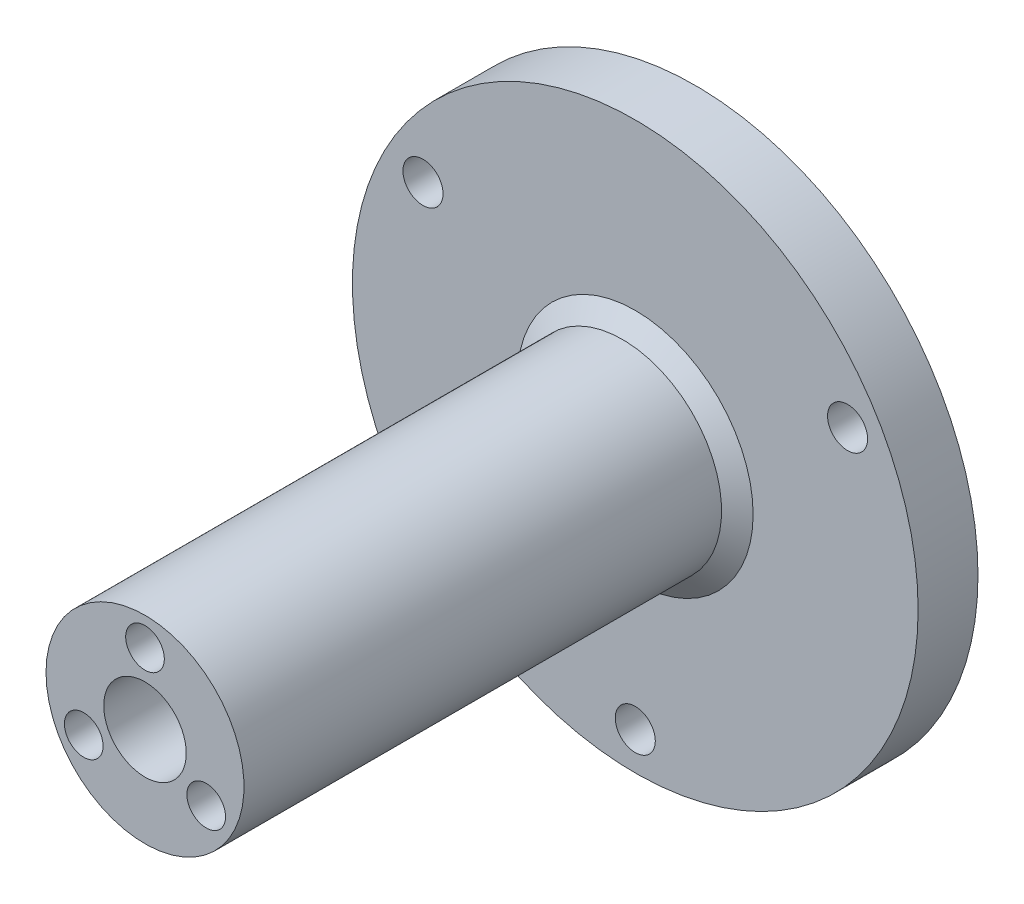
ISO-10303-21;
HEADER;
FILE_DESCRIPTION(('STEP AP214'),'2;1');
FILE_NAME('part.step','',(''),(''),'','','');
FILE_SCHEMA(('AUTOMOTIVE_DESIGN { 1 0 10303 214 1 1 1 1 }'));
ENDSEC;
DATA;
#1=APPLICATION_CONTEXT('core data for automotive mechanical design processes');
#2=APPLICATION_PROTOCOL_DEFINITION('international standard','automotive_design',2000,#1);
#3=PRODUCT_CONTEXT('',#1,'mechanical');
#4=PRODUCT('Part','Part','',(#3));
#5=PRODUCT_RELATED_PRODUCT_CATEGORY('part','',(#4));
#6=PRODUCT_DEFINITION_FORMATION('','',#4);
#7=PRODUCT_DEFINITION_CONTEXT('part definition',#1,'design');
#8=PRODUCT_DEFINITION('design','',#6,#7);
#9=PRODUCT_DEFINITION_SHAPE('','',#8);
#10=(LENGTH_UNIT() NAMED_UNIT(*) SI_UNIT(.MILLI.,.METRE.));
#11=(NAMED_UNIT(*) PLANE_ANGLE_UNIT() SI_UNIT($,.RADIAN.));
#12=(NAMED_UNIT(*) SI_UNIT($,.STERADIAN.) SOLID_ANGLE_UNIT());
#13=UNCERTAINTY_MEASURE_WITH_UNIT(LENGTH_MEASURE(1.E-05),#10,'distance_accuracy_value','');
#14=(GEOMETRIC_REPRESENTATION_CONTEXT(3) GLOBAL_UNCERTAINTY_ASSIGNED_CONTEXT((#13)) GLOBAL_UNIT_ASSIGNED_CONTEXT((#10,
#11,#12)) REPRESENTATION_CONTEXT('',''));
#15=CARTESIAN_POINT('',(0.,0.,0.));
#16=DIRECTION('',(0.,0.,1.));
#17=DIRECTION('',(1.,0.,0.));
#18=AXIS2_PLACEMENT_3D('',#15,#16,#17);
#19=CARTESIAN_POINT('',(0.,0.,6.35));
#20=DIRECTION('',(0.,0.,1.));
#21=DIRECTION('',(1.,0.,0.));
#22=AXIS2_PLACEMENT_3D('',#19,#20,#21);
#23=PLANE('',#22);
#24=CARTESIAN_POINT('',(0.,0.,6.35));
#25=DIRECTION('',(0.,0.,1.));
#26=DIRECTION('',(1.,0.,0.));
#27=AXIS2_PLACEMENT_3D('',#24,#25,#26);
#28=CIRCLE('',#27,12.5);
#29=CARTESIAN_POINT('',(12.5,0.,6.35));
#30=VERTEX_POINT('',#29);
#31=EDGE_CURVE('E10',#30,#30,#28,.F.);
#32=ORIENTED_EDGE('',*,*,#31,.T.);
#33=EDGE_LOOP('',(#32));
#34=FACE_BOUND('',#33,.T.);
#35=CARTESIAN_POINT('',(0.,0.,6.35));
#36=DIRECTION('',(0.,0.,1.));
#37=DIRECTION('',(1.,0.,0.));
#38=AXIS2_PLACEMENT_3D('',#35,#36,#37);
#39=CIRCLE('',#38,30.);
#40=CARTESIAN_POINT('',(30.,0.,6.35));
#41=VERTEX_POINT('',#40);
#42=EDGE_CURVE('E59',#41,#41,#39,.T.);
#43=ORIENTED_EDGE('',*,*,#42,.T.);
#44=EDGE_LOOP('',(#43));
#45=FACE_BOUND('',#44,.T.);
#46=CARTESIAN_POINT('',(0.,-26.,6.35));
#47=DIRECTION('',(0.,0.,1.));
#48=DIRECTION('',(1.,0.,0.));
#49=AXIS2_PLACEMENT_3D('',#46,#47,#48);
#50=CIRCLE('',#49,2.125);
#51=CARTESIAN_POINT('',(2.125,-26.,6.35));
#52=VERTEX_POINT('',#51);
#53=EDGE_CURVE('E79',#52,#52,#50,.T.);
#54=ORIENTED_EDGE('',*,*,#53,.F.);
#55=EDGE_LOOP('',(#54));
#56=FACE_BOUND('',#55,.T.);
#57=CARTESIAN_POINT('',(22.5166604983954,13.,6.35));
#58=DIRECTION('',(0.,0.,1.));
#59=DIRECTION('',(1.,0.,0.));
#60=AXIS2_PLACEMENT_3D('',#57,#58,#59);
#61=CIRCLE('',#60,2.125);
#62=CARTESIAN_POINT('',(24.6416604983954,13.,6.35));
#63=VERTEX_POINT('',#62);
#64=EDGE_CURVE('E82',#63,#63,#61,.T.);
#65=ORIENTED_EDGE('',*,*,#64,.F.);
#66=EDGE_LOOP('',(#65));
#67=FACE_BOUND('',#66,.T.);
#68=CARTESIAN_POINT('',(-22.5166604983954,13.,6.35));
#69=DIRECTION('',(0.,0.,1.));
#70=DIRECTION('',(1.,0.,0.));
#71=AXIS2_PLACEMENT_3D('',#68,#69,#70);
#72=CIRCLE('',#71,2.125);
#73=CARTESIAN_POINT('',(-20.3916604983954,13.,6.35));
#74=VERTEX_POINT('',#73);
#75=EDGE_CURVE('E63',#74,#74,#72,.T.);
#76=ORIENTED_EDGE('',*,*,#75,.F.);
#77=EDGE_LOOP('',(#76));
#78=FACE_BOUND('',#77,.T.);
#79=ADVANCED_FACE('F38',(#34,#45,#56,#67,#78),#23,.T.);
#80=CARTESIAN_POINT('',(0.,0.,6.35));
#81=DIRECTION('',(0.,0.,-1.));
#82=DIRECTION('',(-1.,0.,0.));
#83=AXIS2_PLACEMENT_3D('',#80,#81,#82);
#84=CYLINDRICAL_SURFACE('',#83,30.);
#85=ORIENTED_EDGE('',*,*,#42,.F.);
#86=EDGE_LOOP('',(#85));
#87=FACE_BOUND('',#86,.T.);
#88=CARTESIAN_POINT('',(0.,0.,0.));
#89=DIRECTION('',(0.,0.,1.));
#90=DIRECTION('',(1.,0.,0.));
#91=AXIS2_PLACEMENT_3D('',#88,#89,#90);
#92=CIRCLE('',#91,30.);
#93=CARTESIAN_POINT('',(30.,0.,0.));
#94=VERTEX_POINT('',#93);
#95=EDGE_CURVE('E64',#94,#94,#92,.T.);
#96=ORIENTED_EDGE('',*,*,#95,.T.);
#97=EDGE_LOOP('',(#96));
#98=FACE_BOUND('',#97,.T.);
#99=ADVANCED_FACE('F145',(#87,#98),#84,.T.);
#100=CARTESIAN_POINT('',(0.,-26.,6.35));
#101=DIRECTION('',(0.,0.,-1.));
#102=DIRECTION('',(-1.,0.,0.));
#103=AXIS2_PLACEMENT_3D('',#100,#101,#102);
#104=CYLINDRICAL_SURFACE('',#103,2.125);
#105=ORIENTED_EDGE('',*,*,#53,.T.);
#106=EDGE_LOOP('',(#105));
#107=FACE_BOUND('',#106,.T.);
#108=CARTESIAN_POINT('',(0.,-26.,0.));
#109=DIRECTION('',(0.,0.,1.));
#110=DIRECTION('',(1.,0.,0.));
#111=AXIS2_PLACEMENT_3D('',#108,#109,#110);
#112=CIRCLE('',#111,2.125);
#113=CARTESIAN_POINT('',(2.125,-26.,0.));
#114=VERTEX_POINT('',#113);
#115=EDGE_CURVE('E67',#114,#114,#112,.T.);
#116=ORIENTED_EDGE('',*,*,#115,.F.);
#117=EDGE_LOOP('',(#116));
#118=FACE_BOUND('',#117,.T.);
#119=ADVANCED_FACE('F150',(#107,#118),#104,.F.);
#120=CARTESIAN_POINT('',(22.5166604983954,13.,6.35));
#121=DIRECTION('',(0.,0.,-1.));
#122=DIRECTION('',(-1.,0.,0.));
#123=AXIS2_PLACEMENT_3D('',#120,#121,#122);
#124=CYLINDRICAL_SURFACE('',#123,2.125);
#125=ORIENTED_EDGE('',*,*,#64,.T.);
#126=EDGE_LOOP('',(#125));
#127=FACE_BOUND('',#126,.T.);
#128=CARTESIAN_POINT('',(22.5166604983954,13.,0.));
#129=DIRECTION('',(0.,0.,1.));
#130=DIRECTION('',(1.,0.,0.));
#131=AXIS2_PLACEMENT_3D('',#128,#129,#130);
#132=CIRCLE('',#131,2.125);
#133=CARTESIAN_POINT('',(24.6416604983954,13.,0.));
#134=VERTEX_POINT('',#133);
#135=EDGE_CURVE('E70',#134,#134,#132,.T.);
#136=ORIENTED_EDGE('',*,*,#135,.F.);
#137=EDGE_LOOP('',(#136));
#138=FACE_BOUND('',#137,.T.);
#139=ADVANCED_FACE('F167',(#127,#138),#124,.F.);
#140=CARTESIAN_POINT('',(-22.5166604983954,13.,6.35));
#141=DIRECTION('',(0.,0.,-1.));
#142=DIRECTION('',(-1.,0.,0.));
#143=AXIS2_PLACEMENT_3D('',#140,#141,#142);
#144=CYLINDRICAL_SURFACE('',#143,2.125);
#145=ORIENTED_EDGE('',*,*,#75,.T.);
#146=EDGE_LOOP('',(#145));
#147=FACE_BOUND('',#146,.T.);
#148=CARTESIAN_POINT('',(-22.5166604983954,13.,0.));
#149=DIRECTION('',(0.,0.,1.));
#150=DIRECTION('',(1.,0.,0.));
#151=AXIS2_PLACEMENT_3D('',#148,#149,#150);
#152=CIRCLE('',#151,2.125);
#153=CARTESIAN_POINT('',(-20.3916604983954,13.,0.));
#154=VERTEX_POINT('',#153);
#155=EDGE_CURVE('E73',#154,#154,#152,.T.);
#156=ORIENTED_EDGE('',*,*,#155,.F.);
#157=EDGE_LOOP('',(#156));
#158=FACE_BOUND('',#157,.T.);
#159=ADVANCED_FACE('F162',(#147,#158),#144,.F.);
#160=CARTESIAN_POINT('',(0.,0.,6.35));
#161=DIRECTION('',(0.,0.,-1.));
#162=DIRECTION('',(-1.,0.,0.));
#163=AXIS2_PLACEMENT_3D('',#160,#161,#162);
#164=CYLINDRICAL_SURFACE('',#163,7.675);
#165=CARTESIAN_POINT('',(0.,0.,45.6374079730314));
#166=DIRECTION('',(0.,0.,1.));
#167=DIRECTION('',(1.,0.,0.));
#168=AXIS2_PLACEMENT_3D('',#165,#166,#167);
#169=CIRCLE('',#168,7.675);
#170=CARTESIAN_POINT('',(-7.675,0.,45.6374079730314));
#171=VERTEX_POINT('',#170);
#172=EDGE_CURVE('E54',#171,#171,#169,.T.);
#173=ORIENTED_EDGE('',*,*,#172,.T.);
#174=EDGE_LOOP('',(#173));
#175=FACE_BOUND('',#174,.T.);
#176=CARTESIAN_POINT('',(0.,0.,0.));
#177=DIRECTION('',(0.,0.,1.));
#178=DIRECTION('',(1.,0.,0.));
#179=AXIS2_PLACEMENT_3D('',#176,#177,#178);
#180=CIRCLE('',#179,7.675);
#181=CARTESIAN_POINT('',(7.675,0.,0.));
#182=VERTEX_POINT('',#181);
#183=EDGE_CURVE('E60',#182,#182,#180,.T.);
#184=ORIENTED_EDGE('',*,*,#183,.F.);
#185=EDGE_LOOP('',(#184));
#186=FACE_BOUND('',#185,.T.);
#187=ADVANCED_FACE('F159',(#175,#186),#164,.F.);
#188=CARTESIAN_POINT('',(0.,0.,0.));
#189=DIRECTION('',(0.,0.,1.));
#190=DIRECTION('',(1.,0.,0.));
#191=AXIS2_PLACEMENT_3D('',#188,#189,#190);
#192=PLANE('',#191);
#193=ORIENTED_EDGE('',*,*,#155,.T.);
#194=EDGE_LOOP('',(#193));
#195=FACE_BOUND('',#194,.T.);
#196=ORIENTED_EDGE('',*,*,#135,.T.);
#197=EDGE_LOOP('',(#196));
#198=FACE_BOUND('',#197,.T.);
#199=ORIENTED_EDGE('',*,*,#115,.T.);
#200=EDGE_LOOP('',(#199));
#201=FACE_BOUND('',#200,.T.);
#202=ORIENTED_EDGE('',*,*,#95,.F.);
#203=EDGE_LOOP('',(#202));
#204=FACE_BOUND('',#203,.T.);
#205=ORIENTED_EDGE('',*,*,#183,.T.);
#206=EDGE_LOOP('',(#205));
#207=FACE_BOUND('',#206,.T.);
#208=ADVANCED_FACE('F156',(#195,#198,#201,#204,#207),#192,.F.);
#209=CARTESIAN_POINT('',(0.,0.,51.35));
#210=DIRECTION('',(0.,0.,-1.));
#211=DIRECTION('',(-1.,0.,0.));
#212=AXIS2_PLACEMENT_3D('',#209,#210,#211);
#213=CYLINDRICAL_SURFACE('',#212,10.5);
#214=CARTESIAN_POINT('',(0.,0.,7.69901703368487));
#215=DIRECTION('',(0.,0.,1.));
#216=DIRECTION('',(1.,0.,0.));
#217=AXIS2_PLACEMENT_3D('',#214,#215,#216);
#218=CIRCLE('',#217,10.5);
#219=CARTESIAN_POINT('',(-10.5,0.,7.69901703368486));
#220=VERTEX_POINT('',#219);
#221=EDGE_CURVE('E46',#220,#220,#218,.T.);
#222=CARTESIAN_POINT('',(0.,0.,58.35));
#223=DIRECTION('',(0.,0.,1.));
#224=DIRECTION('',(1.,0.,0.));
#225=AXIS2_PLACEMENT_3D('',#222,#223,#224);
#226=CIRCLE('',#225,10.5);
#227=CARTESIAN_POINT('',(-10.5,0.,58.35));
#228=VERTEX_POINT('',#227);
#229=EDGE_CURVE('E76',#228,#228,#226,.T.);
#230=CARTESIAN_POINT('',(-10.5,0.,7.69901703368486));
#231=CARTESIAN_POINT('',(-10.5,0.,8.22663143958398));
#232=CARTESIAN_POINT('',(-10.5,0.,8.75424584548309));
#233=CARTESIAN_POINT('',(-10.5,0.,9.80947465728132));
#234=CARTESIAN_POINT('',(-10.5,0.,10.3370890631804));
#235=CARTESIAN_POINT('',(-10.5,0.,11.3923178749787));
#236=CARTESIAN_POINT('',(-10.5,0.,11.9199322808778));
#237=CARTESIAN_POINT('',(-10.5,0.,12.975161092676));
#238=CARTESIAN_POINT('',(-10.5,0.,13.5027754985751));
#239=CARTESIAN_POINT('',(-10.5,0.,14.5580043103734));
#240=CARTESIAN_POINT('',(-10.5,0.,15.0856187162725));
#241=CARTESIAN_POINT('',(-10.5,0.,16.1408475280707));
#242=CARTESIAN_POINT('',(-10.5,0.,16.6684619339698));
#243=CARTESIAN_POINT('',(-10.5,0.,17.7236907457681));
#244=CARTESIAN_POINT('',(-10.5,0.,18.2513051516672));
#245=CARTESIAN_POINT('',(-10.5,0.,19.3065339634654));
#246=CARTESIAN_POINT('',(-10.5,0.,19.8341483693645));
#247=CARTESIAN_POINT('',(-10.5,0.,20.8893771811628));
#248=CARTESIAN_POINT('',(-10.5,0.,21.4169915870619));
#249=CARTESIAN_POINT('',(-10.5,0.,22.4722203988601));
#250=CARTESIAN_POINT('',(-10.5,0.,22.9998348047592));
#251=CARTESIAN_POINT('',(-10.5,0.,24.0550636165575));
#252=CARTESIAN_POINT('',(-10.5,0.,24.5826780224566));
#253=CARTESIAN_POINT('',(-10.5,0.,25.6379068342548));
#254=CARTESIAN_POINT('',(-10.5,0.,26.1655212401539));
#255=CARTESIAN_POINT('',(-10.5,0.,27.2207500519521));
#256=CARTESIAN_POINT('',(-10.5,0.,27.7483644578513));
#257=CARTESIAN_POINT('',(-10.5,0.,28.8035932696495));
#258=CARTESIAN_POINT('',(-10.5,0.,29.3312076755486));
#259=CARTESIAN_POINT('',(-10.5,0.,30.3864364873468));
#260=CARTESIAN_POINT('',(-10.5,0.,30.914050893246));
#261=CARTESIAN_POINT('',(-10.5,0.,31.9692797050442));
#262=CARTESIAN_POINT('',(-10.5,0.,32.4968941109433));
#263=CARTESIAN_POINT('',(-10.5,0.,33.5521229227415));
#264=CARTESIAN_POINT('',(-10.5,0.,34.0797373286407));
#265=CARTESIAN_POINT('',(-10.5,0.,35.1349661404389));
#266=CARTESIAN_POINT('',(-10.5,0.,35.662580546338));
#267=CARTESIAN_POINT('',(-10.5,0.,36.7178093581362));
#268=CARTESIAN_POINT('',(-10.5,0.,37.2454237640354));
#269=CARTESIAN_POINT('',(-10.5,0.,38.3006525758336));
#270=CARTESIAN_POINT('',(-10.5,0.,38.8282669817327));
#271=CARTESIAN_POINT('',(-10.5,0.,39.8834957935309));
#272=CARTESIAN_POINT('',(-10.5,0.,40.41111019943));
#273=CARTESIAN_POINT('',(-10.5,0.,41.4663390112283));
#274=CARTESIAN_POINT('',(-10.5,0.,41.9939534171274));
#275=CARTESIAN_POINT('',(-10.5,0.,43.0491822289256));
#276=CARTESIAN_POINT('',(-10.5,0.,43.5767966348247));
#277=CARTESIAN_POINT('',(-10.5,0.,44.632025446623));
#278=CARTESIAN_POINT('',(-10.5,0.,45.1596398525221));
#279=CARTESIAN_POINT('',(-10.5,0.,46.2148686643203));
#280=CARTESIAN_POINT('',(-10.5,0.,46.7424830702194));
#281=CARTESIAN_POINT('',(-10.5,0.,47.7977118820177));
#282=CARTESIAN_POINT('',(-10.5,0.,48.3253262879168));
#283=CARTESIAN_POINT('',(-10.5,0.,49.380555099715));
#284=CARTESIAN_POINT('',(-10.5,0.,49.9081695056141));
#285=CARTESIAN_POINT('',(-10.5,0.,50.9633983174124));
#286=CARTESIAN_POINT('',(-10.5,0.,51.4910127233115));
#287=CARTESIAN_POINT('',(-10.5,0.,52.5462415351097));
#288=CARTESIAN_POINT('',(-10.5,0.,53.0738559410088));
#289=CARTESIAN_POINT('',(-10.5,0.,54.1290847528071));
#290=CARTESIAN_POINT('',(-10.5,0.,54.6566991587062));
#291=CARTESIAN_POINT('',(-10.5,0.,55.7119279705044));
#292=CARTESIAN_POINT('',(-10.5,0.,56.2395423764035));
#293=CARTESIAN_POINT('',(-10.5,0.,57.2947711882018));
#294=CARTESIAN_POINT('',(-10.5,0.,57.8223855941009));
#295=CARTESIAN_POINT('',(-10.5,0.,58.35));
#296=B_SPLINE_CURVE_WITH_KNOTS('',3,(#230,#231,#232,#233,#234,#235,#236,#237,#238,#239,#240,
#241,#242,#243,#244,#245,#246,#247,#248,#249,#250,#251,#252,#253,#254,#255,#256,#257,#258,#259,
#260,#261,#262,#263,#264,#265,#266,#267,#268,#269,#270,#271,#272,#273,#274,#275,#276,#277,#278,
#279,#280,#281,#282,#283,#284,#285,#286,#287,#288,#289,#290,#291,#292,#293,#294,#295),
.UNSPECIFIED.,.F.,.F.,(4,2,2,2,2,2,2,2,2,2,2,2,2,2,2,2,2,2,2,2,2,2,2,2,2,2,2,2,2,2,2,2,4),(0.,
1.58284321769735,3.16568643539469,4.74852965309204,6.33137287078939,7.91421608848674,
9.49705930618409,11.0799025238814,12.6627457415788,14.2455889592761,15.8284321769735,
17.4112753946708,18.9941186123682,20.5769618300655,22.1598050477629,23.7426482654602,
25.3254914831576,26.9083347008549,28.4911779185523,30.0740211362496,31.656864353947,
33.2397075716443,34.8225507893416,36.405394007039,37.9882372247363,39.5710804424337,
41.153923660131,42.7367668778284,44.3196100955257,45.9024533132231,47.4852965309204,
49.0681397486178,50.6509829663151),.UNSPECIFIED.);
#297=EDGE_CURVE('BSEAM124',#220,#228,#296,.T.);
#298=ORIENTED_EDGE('',*,*,#221,.T.);
#299=ORIENTED_EDGE('',*,*,#229,.F.);
#300=ORIENTED_EDGE('',*,*,#297,.T.);
#301=ORIENTED_EDGE('',*,*,#297,.F.);
#302=EDGE_LOOP('',(#298,#300,#299,#301));
#303=FACE_BOUND('',#302,.T.);
#304=ADVANCED_FACE('F124',(#303),#213,.T.);
#305=CARTESIAN_POINT('',(0.,0.,58.35));
#306=DIRECTION('',(0.,0.,1.));
#307=DIRECTION('',(1.,0.,0.));
#308=AXIS2_PLACEMENT_3D('',#305,#306,#307);
#309=PLANE('',#308);
#310=CARTESIAN_POINT('',(0.,7.5,58.35));
#311=DIRECTION('',(0.,0.,1.));
#312=DIRECTION('',(1.,0.,0.));
#313=AXIS2_PLACEMENT_3D('',#310,#311,#312);
#314=CIRCLE('',#313,2.05);
#315=CARTESIAN_POINT('',(2.05,7.5,58.35));
#316=VERTEX_POINT('',#315);
#317=EDGE_CURVE('E105',#316,#316,#314,.T.);
#318=ORIENTED_EDGE('',*,*,#317,.F.);
#319=EDGE_LOOP('',(#318));
#320=FACE_BOUND('',#319,.T.);
#321=CARTESIAN_POINT('',(-6.49519052838329,-3.75,58.35));
#322=DIRECTION('',(0.,0.,1.));
#323=DIRECTION('',(1.,0.,0.));
#324=AXIS2_PLACEMENT_3D('',#321,#322,#323);
#325=CIRCLE('',#324,2.05);
#326=CARTESIAN_POINT('',(-4.44519052838329,-3.75,58.35));
#327=VERTEX_POINT('',#326);
#328=EDGE_CURVE('E99',#327,#327,#325,.T.);
#329=ORIENTED_EDGE('',*,*,#328,.F.);
#330=EDGE_LOOP('',(#329));
#331=FACE_BOUND('',#330,.T.);
#332=CARTESIAN_POINT('',(6.49519052838329,-3.75,58.35));
#333=DIRECTION('',(0.,0.,1.));
#334=DIRECTION('',(1.,0.,0.));
#335=AXIS2_PLACEMENT_3D('',#332,#333,#334);
#336=CIRCLE('',#335,2.05);
#337=CARTESIAN_POINT('',(8.54519052838329,-3.75,58.35));
#338=VERTEX_POINT('',#337);
#339=EDGE_CURVE('E93',#338,#338,#336,.T.);
#340=ORIENTED_EDGE('',*,*,#339,.F.);
#341=EDGE_LOOP('',(#340));
#342=FACE_BOUND('',#341,.T.);
#343=ORIENTED_EDGE('',*,*,#229,.T.);
#344=EDGE_LOOP('',(#343));
#345=FACE_BOUND('',#344,.T.);
#346=CARTESIAN_POINT('',(0.,0.,58.35));
#347=DIRECTION('',(0.,0.,1.));
#348=DIRECTION('',(1.,0.,0.));
#349=AXIS2_PLACEMENT_3D('',#346,#347,#348);
#350=CIRCLE('',#349,4.375);
#351=CARTESIAN_POINT('',(4.375,0.,58.35));
#352=VERTEX_POINT('',#351);
#353=EDGE_CURVE('E89',#352,#352,#350,.T.);
#354=ORIENTED_EDGE('',*,*,#353,.F.);
#355=EDGE_LOOP('',(#354));
#356=FACE_BOUND('',#355,.T.);
#357=ADVANCED_FACE('F120',(#320,#331,#342,#345,#356),#309,.T.);
#358=CARTESIAN_POINT('',(0.,0.,58.35));
#359=DIRECTION('',(0.,0.,-1.));
#360=DIRECTION('',(-1.,0.,0.));
#361=AXIS2_PLACEMENT_3D('',#358,#359,#360);
#362=CYLINDRICAL_SURFACE('',#361,4.375);
#363=CARTESIAN_POINT('',(0.,0.,50.3502963952805));
#364=DIRECTION('',(0.,0.,-1.));
#365=DIRECTION('',(-1.,0.,0.));
#366=AXIS2_PLACEMENT_3D('',#363,#364,#365);
#367=CIRCLE('',#366,4.375);
#368=CARTESIAN_POINT('',(-4.375,0.,50.3502963952805));
#369=VERTEX_POINT('',#368);
#370=EDGE_CURVE('E50',#369,#369,#367,.T.);
#371=ORIENTED_EDGE('',*,*,#370,.T.);
#372=EDGE_LOOP('',(#371));
#373=FACE_BOUND('',#372,.T.);
#374=ORIENTED_EDGE('',*,*,#353,.T.);
#375=EDGE_LOOP('',(#374));
#376=FACE_BOUND('',#375,.T.);
#377=ADVANCED_FACE('F123',(#373,#376),#362,.F.);
#378=CARTESIAN_POINT('',(6.49519052838329,-3.75,52.35));
#379=DIRECTION('',(0.,0.,1.));
#380=DIRECTION('',(1.,0.,0.));
#381=AXIS2_PLACEMENT_3D('',#378,#379,#380);
#382=CYLINDRICAL_SURFACE('',#381,2.05);
#383=CARTESIAN_POINT('',(6.49519052838329,-3.75,52.35));
#384=DIRECTION('',(0.,0.,1.));
#385=DIRECTION('',(1.,0.,0.));
#386=AXIS2_PLACEMENT_3D('',#383,#384,#385);
#387=CIRCLE('',#386,2.05);
#388=CARTESIAN_POINT('',(8.54519052838329,-3.75,52.35));
#389=VERTEX_POINT('',#388);
#390=EDGE_CURVE('E96',#389,#389,#387,.T.);
#391=ORIENTED_EDGE('',*,*,#390,.F.);
#392=EDGE_LOOP('',(#391));
#393=FACE_BOUND('',#392,.T.);
#394=ORIENTED_EDGE('',*,*,#339,.T.);
#395=EDGE_LOOP('',(#394));
#396=FACE_BOUND('',#395,.T.);
#397=ADVANCED_FACE('F135',(#393,#396),#382,.F.);
#398=CARTESIAN_POINT('',(0.,0.,52.35));
#399=DIRECTION('',(0.,0.,1.));
#400=DIRECTION('',(1.,0.,0.));
#401=AXIS2_PLACEMENT_3D('',#398,#399,#400);
#402=PLANE('',#401);
#403=ORIENTED_EDGE('',*,*,#390,.T.);
#404=EDGE_LOOP('',(#403));
#405=FACE_BOUND('',#404,.T.);
#406=ADVANCED_FACE('F141',(#405),#402,.T.);
#407=CARTESIAN_POINT('',(-6.49519052838329,-3.75,52.35));
#408=DIRECTION('',(0.,0.,1.));
#409=DIRECTION('',(1.,0.,0.));
#410=AXIS2_PLACEMENT_3D('',#407,#408,#409);
#411=CYLINDRICAL_SURFACE('',#410,2.05);
#412=CARTESIAN_POINT('',(-6.49519052838329,-3.75,52.35));
#413=DIRECTION('',(0.,0.,1.));
#414=DIRECTION('',(1.,0.,0.));
#415=AXIS2_PLACEMENT_3D('',#412,#413,#414);
#416=CIRCLE('',#415,2.05);
#417=CARTESIAN_POINT('',(-4.44519052838329,-3.75,52.35));
#418=VERTEX_POINT('',#417);
#419=EDGE_CURVE('E102',#418,#418,#416,.T.);
#420=ORIENTED_EDGE('',*,*,#419,.F.);
#421=EDGE_LOOP('',(#420));
#422=FACE_BOUND('',#421,.T.);
#423=ORIENTED_EDGE('',*,*,#328,.T.);
#424=EDGE_LOOP('',(#423));
#425=FACE_BOUND('',#424,.T.);
#426=ADVANCED_FACE('F197',(#422,#425),#411,.F.);
#427=CARTESIAN_POINT('',(0.,0.,52.35));
#428=DIRECTION('',(0.,0.,1.));
#429=DIRECTION('',(1.,0.,0.));
#430=AXIS2_PLACEMENT_3D('',#427,#428,#429);
#431=PLANE('',#430);
#432=ORIENTED_EDGE('',*,*,#419,.T.);
#433=EDGE_LOOP('',(#432));
#434=FACE_BOUND('',#433,.T.);
#435=ADVANCED_FACE('F116',(#434),#431,.T.);
#436=CARTESIAN_POINT('',(0.,7.5,52.35));
#437=DIRECTION('',(0.,0.,1.));
#438=DIRECTION('',(1.,0.,0.));
#439=AXIS2_PLACEMENT_3D('',#436,#437,#438);
#440=CYLINDRICAL_SURFACE('',#439,2.05);
#441=CARTESIAN_POINT('',(0.,7.5,52.35));
#442=DIRECTION('',(0.,0.,1.));
#443=DIRECTION('',(1.,0.,0.));
#444=AXIS2_PLACEMENT_3D('',#441,#442,#443);
#445=CIRCLE('',#444,2.05);
#446=CARTESIAN_POINT('',(2.05,7.5,52.35));
#447=VERTEX_POINT('',#446);
#448=EDGE_CURVE('E92',#447,#447,#445,.T.);
#449=ORIENTED_EDGE('',*,*,#448,.F.);
#450=EDGE_LOOP('',(#449));
#451=FACE_BOUND('',#450,.T.);
#452=ORIENTED_EDGE('',*,*,#317,.T.);
#453=EDGE_LOOP('',(#452));
#454=FACE_BOUND('',#453,.T.);
#455=ADVANCED_FACE('F113',(#451,#454),#440,.F.);
#456=CARTESIAN_POINT('',(0.,0.,52.35));
#457=DIRECTION('',(0.,0.,1.));
#458=DIRECTION('',(1.,0.,0.));
#459=AXIS2_PLACEMENT_3D('',#456,#457,#458);
#460=PLANE('',#459);
#461=ORIENTED_EDGE('',*,*,#448,.T.);
#462=EDGE_LOOP('',(#461));
#463=FACE_BOUND('',#462,.T.);
#464=ADVANCED_FACE('F111',(#463),#460,.T.);
#465=CARTESIAN_POINT('',(0.,0.,45.6374079730314));
#466=DIRECTION('',(0.,0.,-1.));
#467=DIRECTION('',(-1.,0.,0.));
#468=AXIS2_PLACEMENT_3D('',#465,#466,#467);
#469=CONICAL_SURFACE('',#468,7.675,0.610865238198011);
#470=CARTESIAN_POINT('',(-4.375,0.,50.3502963952805));
#471=CARTESIAN_POINT('',(-4.409375,0.,50.3012038075487));
#472=CARTESIAN_POINT('',(-4.44375,0.,50.2521112198169));
#473=CARTESIAN_POINT('',(-4.5125,0.,50.1539260443534));
#474=CARTESIAN_POINT('',(-4.546875,0.,50.1048334566216));
#475=CARTESIAN_POINT('',(-4.615625,0.,50.0066482811581));
#476=CARTESIAN_POINT('',(-4.65,0.,49.9575556934264));
#477=CARTESIAN_POINT('',(-4.71875,0.,49.8593705179628));
#478=CARTESIAN_POINT('',(-4.753125,0.,49.8102779302311));
#479=CARTESIAN_POINT('',(-4.821875,0.,49.7120927547676));
#480=CARTESIAN_POINT('',(-4.85625,0.,49.6630001670358));
#481=CARTESIAN_POINT('',(-4.925,0.,49.5648149915723));
#482=CARTESIAN_POINT('',(-4.959375,0.,49.5157224038405));
#483=CARTESIAN_POINT('',(-5.028125,0.,49.417537228377));
#484=CARTESIAN_POINT('',(-5.0625,0.,49.3684446406452));
#485=CARTESIAN_POINT('',(-5.13125,0.,49.2702594651817));
#486=CARTESIAN_POINT('',(-5.165625,0.,49.22116687745));
#487=CARTESIAN_POINT('',(-5.234375,0.,49.1229817019864));
#488=CARTESIAN_POINT('',(-5.26875,0.,49.0738891142547));
#489=CARTESIAN_POINT('',(-5.3375,0.,48.9757039387912));
#490=CARTESIAN_POINT('',(-5.371875,0.,48.9266113510594));
#491=CARTESIAN_POINT('',(-5.440625,0.,48.8284261755959));
#492=CARTESIAN_POINT('',(-5.475,0.,48.7793335878641));
#493=CARTESIAN_POINT('',(-5.54375,0.,48.6811484124006));
#494=CARTESIAN_POINT('',(-5.578125,0.,48.6320558246688));
#495=CARTESIAN_POINT('',(-5.646875,0.,48.5338706492053));
#496=CARTESIAN_POINT('',(-5.68125,0.,48.4847780614735));
#497=CARTESIAN_POINT('',(-5.75,0.,48.38659288601));
#498=CARTESIAN_POINT('',(-5.784375,0.,48.3375002982783));
#499=CARTESIAN_POINT('',(-5.853125,0.,48.2393151228147));
#500=CARTESIAN_POINT('',(-5.8875,0.,48.190222535083));
#501=CARTESIAN_POINT('',(-5.95625,0.,48.0920373596195));
#502=CARTESIAN_POINT('',(-5.990625,0.,48.0429447718877));
#503=CARTESIAN_POINT('',(-6.059375,0.,47.9447595964242));
#504=CARTESIAN_POINT('',(-6.09375,0.,47.8956670086924));
#505=CARTESIAN_POINT('',(-6.1625,0.,47.7974818332289));
#506=CARTESIAN_POINT('',(-6.196875,0.,47.7483892454971));
#507=CARTESIAN_POINT('',(-6.265625,0.,47.6502040700336));
#508=CARTESIAN_POINT('',(-6.3,0.,47.6011114823019));
#509=CARTESIAN_POINT('',(-6.36875,0.,47.5029263068383));
#510=CARTESIAN_POINT('',(-6.403125,0.,47.4538337191066));
#511=CARTESIAN_POINT('',(-6.471875,0.,47.3556485436431));
#512=CARTESIAN_POINT('',(-6.50625,0.,47.3065559559113));
#513=CARTESIAN_POINT('',(-6.575,0.,47.2083707804478));
#514=CARTESIAN_POINT('',(-6.609375,0.,47.159278192716));
#515=CARTESIAN_POINT('',(-6.678125,0.,47.0610930172525));
#516=CARTESIAN_POINT('',(-6.7125,0.,47.0120004295207));
#517=CARTESIAN_POINT('',(-6.78125,0.,46.9138152540572));
#518=CARTESIAN_POINT('',(-6.815625,0.,46.8647226663254));
#519=CARTESIAN_POINT('',(-6.884375,0.,46.7665374908619));
#520=CARTESIAN_POINT('',(-6.91875,0.,46.7174449031302));
#521=CARTESIAN_POINT('',(-6.9875,0.,46.6192597276666));
#522=CARTESIAN_POINT('',(-7.021875,0.,46.5701671399349));
#523=CARTESIAN_POINT('',(-7.090625,0.,46.4719819644714));
#524=CARTESIAN_POINT('',(-7.125,0.,46.4228893767396));
#525=CARTESIAN_POINT('',(-7.19375,0.,46.3247042012761));
#526=CARTESIAN_POINT('',(-7.228125,0.,46.2756116135443));
#527=CARTESIAN_POINT('',(-7.296875,0.,46.1774264380808));
#528=CARTESIAN_POINT('',(-7.33125,0.,46.128333850349));
#529=CARTESIAN_POINT('',(-7.4,0.,46.0301486748855));
#530=CARTESIAN_POINT('',(-7.434375,0.,45.9810560871537));
#531=CARTESIAN_POINT('',(-7.503125,0.,45.8828709116902));
#532=CARTESIAN_POINT('',(-7.5375,0.,45.8337783239585));
#533=CARTESIAN_POINT('',(-7.60625,0.,45.7355931484949));
#534=CARTESIAN_POINT('',(-7.640625,0.,45.6865005607632));
#535=CARTESIAN_POINT('',(-7.675,0.,45.6374079730314));
#536=B_SPLINE_CURVE_WITH_KNOTS('',3,(#470,#471,#472,#473,#474,#475,#476,#477,#478,#479,#480,
#481,#482,#483,#484,#485,#486,#487,#488,#489,#490,#491,#492,#493,#494,#495,#496,#497,#498,#499,
#500,#501,#502,#503,#504,#505,#506,#507,#508,#509,#510,#511,#512,#513,#514,#515,#516,#517,#518,
#519,#520,#521,#522,#523,#524,#525,#526,#527,#528,#529,#530,#531,#532,#533,#534,#535),
.UNSPECIFIED.,.F.,.F.,(4,2,2,2,2,2,2,2,2,2,2,2,2,2,2,2,2,2,2,2,2,2,2,2,2,2,2,2,2,2,2,2,4),(0.,
0.17979295079843,0.359585901596855,0.539378852395285,0.71917180319371,0.89896475399214,
1.07875770479056,1.25855065558899,1.43834360638742,1.61813655718584,1.79792950798427,
1.9777224587827,2.15751540958113,2.33730836037955,2.51710131117798,2.69689426197641,
2.87668721277483,3.05648016357326,3.23627311437169,3.41606606517012,3.59585901596854,
3.77565196676697,3.9554449175654,4.13523786836383,4.31503081916225,4.49482376996068,
4.67461672075911,4.85440967155753,5.03420262235596,5.21399557315438,5.39378852395282,
5.57358147475124,5.75337442554966),.UNSPECIFIED.);
#537=EDGE_CURVE('BSEAM175',#369,#171,#536,.T.);
#538=ORIENTED_EDGE('',*,*,#370,.F.);
#539=ORIENTED_EDGE('',*,*,#172,.F.);
#540=ORIENTED_EDGE('',*,*,#537,.T.);
#541=ORIENTED_EDGE('',*,*,#537,.F.);
#542=EDGE_LOOP('',(#538,#540,#539,#541));
#543=FACE_BOUND('',#542,.T.);
#544=ADVANCED_FACE('F175',(#543),#469,.F.);
#545=CARTESIAN_POINT('',(0.,0.,7.69901703368487));
#546=DIRECTION('',(0.,0.,-1.));
#547=DIRECTION('',(-1.,0.,0.));
#548=AXIS2_PLACEMENT_3D('',#545,#546,#547);
#549=CONICAL_SURFACE('',#548,10.5,0.977384381116822);
#550=ORIENTED_EDGE('',*,*,#31,.F.);
#551=EDGE_LOOP('',(#550));
#552=FACE_BOUND('',#551,.T.);
#553=ORIENTED_EDGE('',*,*,#221,.F.);
#554=EDGE_LOOP('',(#553));
#555=FACE_BOUND('',#554,.T.);
#556=ADVANCED_FACE('F41',(#552,#555),#549,.T.);
#557=CLOSED_SHELL('',(#79,#99,#119,#139,#159,#187,#208,#304,#357,#377,#397,#406,#426,#435,#455,
#464,#544,#556));
#558=MANIFOLD_SOLID_BREP('B2',#557);
#559=ADVANCED_BREP_SHAPE_REPRESENTATION('',(#18,#558),#14);
#560=SHAPE_DEFINITION_REPRESENTATION(#9,#559);
ENDSEC;
END-ISO-10303-21;
